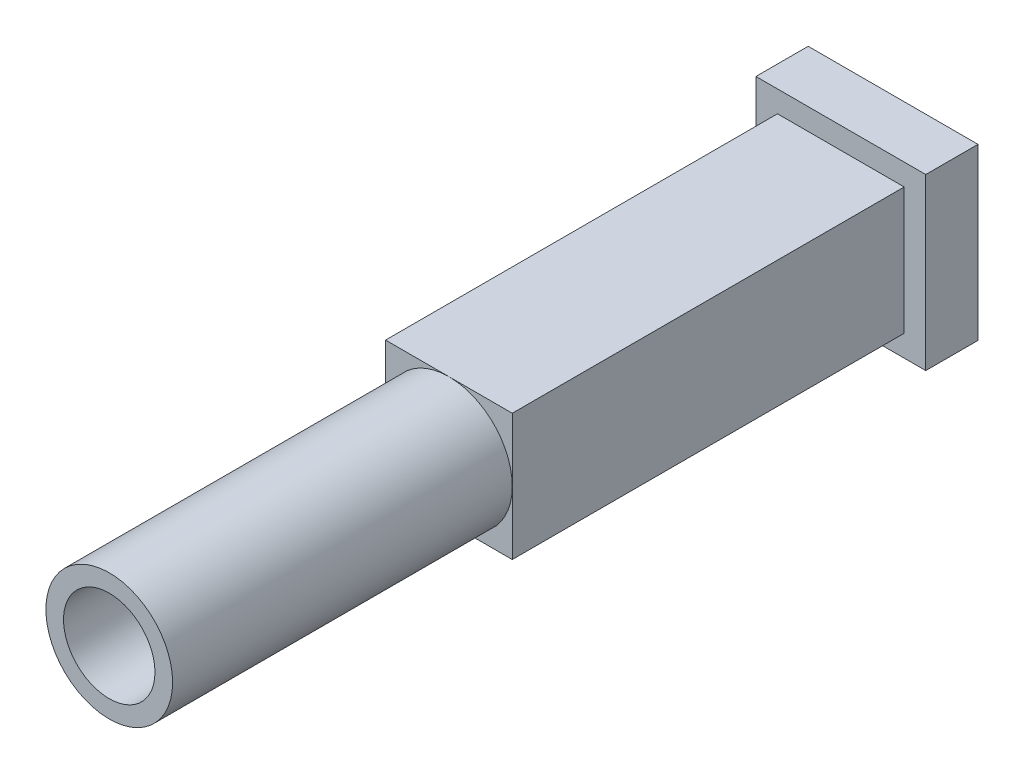
ISO-10303-21;
HEADER;
FILE_DESCRIPTION(('STEP AP214'),'2;1');
FILE_NAME('part.step','',(''),(''),'','','');
FILE_SCHEMA(('AUTOMOTIVE_DESIGN { 1 0 10303 214 1 1 1 1 }'));
ENDSEC;
DATA;
#1=APPLICATION_CONTEXT('core data for automotive mechanical design processes');
#2=APPLICATION_PROTOCOL_DEFINITION('international standard','automotive_design',2000,#1);
#3=PRODUCT_CONTEXT('',#1,'mechanical');
#4=PRODUCT('Part','Part','',(#3));
#5=PRODUCT_RELATED_PRODUCT_CATEGORY('part','',(#4));
#6=PRODUCT_DEFINITION_FORMATION('','',#4);
#7=PRODUCT_DEFINITION_CONTEXT('part definition',#1,'design');
#8=PRODUCT_DEFINITION('design','',#6,#7);
#9=PRODUCT_DEFINITION_SHAPE('','',#8);
#10=(LENGTH_UNIT() NAMED_UNIT(*) SI_UNIT(.MILLI.,.METRE.));
#11=(NAMED_UNIT(*) PLANE_ANGLE_UNIT() SI_UNIT($,.RADIAN.));
#12=(NAMED_UNIT(*) SI_UNIT($,.STERADIAN.) SOLID_ANGLE_UNIT());
#13=UNCERTAINTY_MEASURE_WITH_UNIT(LENGTH_MEASURE(1.E-05),#10,'distance_accuracy_value','');
#14=(GEOMETRIC_REPRESENTATION_CONTEXT(3) GLOBAL_UNCERTAINTY_ASSIGNED_CONTEXT((#13)) GLOBAL_UNIT_ASSIGNED_CONTEXT((#10,
#11,#12)) REPRESENTATION_CONTEXT('',''));
#15=CARTESIAN_POINT('',(0.,0.,0.));
#16=DIRECTION('',(0.,0.,1.));
#17=DIRECTION('',(1.,0.,0.));
#18=AXIS2_PLACEMENT_3D('',#15,#16,#17);
#19=CARTESIAN_POINT('',(0.,0.,30.));
#20=DIRECTION('',(0.,0.,1.));
#21=DIRECTION('',(1.,0.,0.));
#22=AXIS2_PLACEMENT_3D('',#19,#20,#21);
#23=PLANE('',#22);
#24=CARTESIAN_POINT('',(4.85,-4.85,30.));
#25=DIRECTION('',(0.,0.,1.));
#26=DIRECTION('',(1.,0.,0.));
#27=AXIS2_PLACEMENT_3D('',#24,#25,#26);
#28=CIRCLE('',#27,4.85);
#29=CARTESIAN_POINT('',(9.7,-4.85,30.));
#30=VERTEX_POINT('',#29);
#31=CARTESIAN_POINT('',(4.85,0.,30.));
#32=VERTEX_POINT('',#31);
#33=EDGE_CURVE('E57',#30,#32,#28,.T.);
#34=ORIENTED_EDGE('',*,*,#33,.F.);
#35=DIRECTION('',(0.,1.,0.));
#36=VECTOR('',#35,1.);
#37=CARTESIAN_POINT('',(9.7,0.,30.));
#38=LINE('',#37,#36);
#39=CARTESIAN_POINT('',(9.7,0.,30.));
#40=VERTEX_POINT('',#39);
#41=EDGE_CURVE('E175',#30,#40,#38,.T.);
#42=ORIENTED_EDGE('',*,*,#41,.T.);
#43=DIRECTION('',(-1.,0.,0.));
#44=VECTOR('',#43,1.);
#45=CARTESIAN_POINT('',(0.,0.,30.));
#46=LINE('',#45,#44);
#47=EDGE_CURVE('E180',#40,#32,#46,.T.);
#48=ORIENTED_EDGE('',*,*,#47,.T.);
#49=EDGE_LOOP('',(#34,#42,#48));
#50=FACE_BOUND('',#49,.T.);
#51=ADVANCED_FACE('F45',(#50),#23,.T.);
#52=CARTESIAN_POINT('',(0.,-4.85,30.));
#53=VERTEX_POINT('',#52);
#54=EDGE_CURVE('E11',#32,#53,#28,.T.);
#55=ORIENTED_EDGE('',*,*,#54,.F.);
#56=CARTESIAN_POINT('',(0.,0.,30.));
#57=VERTEX_POINT('',#56);
#58=EDGE_CURVE('E179',#32,#57,#46,.T.);
#59=ORIENTED_EDGE('',*,*,#58,.T.);
#60=DIRECTION('',(0.,-1.,0.));
#61=VECTOR('',#60,1.);
#62=CARTESIAN_POINT('',(0.,0.,30.));
#63=LINE('',#62,#61);
#64=EDGE_CURVE('E166',#57,#53,#63,.T.);
#65=ORIENTED_EDGE('',*,*,#64,.T.);
#66=EDGE_LOOP('',(#55,#59,#65));
#67=FACE_BOUND('',#66,.T.);
#68=ADVANCED_FACE('F228',(#67),#23,.T.);
#69=CARTESIAN_POINT('',(4.85,-9.7,30.));
#70=VERTEX_POINT('',#69);
#71=EDGE_CURVE('E55',#53,#70,#28,.T.);
#72=ORIENTED_EDGE('',*,*,#71,.F.);
#73=CARTESIAN_POINT('',(0.,-9.7,30.));
#74=VERTEX_POINT('',#73);
#75=EDGE_CURVE('E170',#53,#74,#63,.T.);
#76=ORIENTED_EDGE('',*,*,#75,.T.);
#77=DIRECTION('',(1.,0.,0.));
#78=VECTOR('',#77,1.);
#79=CARTESIAN_POINT('',(0.,-9.7,30.));
#80=LINE('',#79,#78);
#81=EDGE_CURVE('E171',#74,#70,#80,.T.);
#82=ORIENTED_EDGE('',*,*,#81,.T.);
#83=EDGE_LOOP('',(#72,#76,#82));
#84=FACE_BOUND('',#83,.T.);
#85=ADVANCED_FACE('F224',(#84),#23,.T.);
#86=CARTESIAN_POINT('',(0.,0.,30.));
#87=DIRECTION('',(1.,0.,0.));
#88=DIRECTION('',(0.,1.,0.));
#89=AXIS2_PLACEMENT_3D('',#86,#87,#88);
#90=PLANE('',#89);
#91=DIRECTION('',(0.,-1.,0.));
#92=VECTOR('',#91,1.);
#93=CARTESIAN_POINT('',(0.,0.,0.));
#94=LINE('',#93,#92);
#95=CARTESIAN_POINT('',(0.,0.,0.));
#96=VERTEX_POINT('',#95);
#97=CARTESIAN_POINT('',(0.,-9.7,0.));
#98=VERTEX_POINT('',#97);
#99=EDGE_CURVE('E164',#96,#98,#94,.T.);
#100=ORIENTED_EDGE('',*,*,#99,.T.);
#101=DIRECTION('',(0.,0.,-1.));
#102=VECTOR('',#101,1.);
#103=CARTESIAN_POINT('',(0.,-9.7,30.));
#104=LINE('',#103,#102);
#105=EDGE_CURVE('E49',#74,#98,#104,.T.);
#106=ORIENTED_EDGE('',*,*,#105,.F.);
#107=ORIENTED_EDGE('',*,*,#75,.F.);
#108=ORIENTED_EDGE('',*,*,#64,.F.);
#109=DIRECTION('',(0.,0.,-1.));
#110=VECTOR('',#109,1.);
#111=CARTESIAN_POINT('',(0.,0.,30.));
#112=LINE('',#111,#110);
#113=EDGE_CURVE('E184',#57,#96,#112,.T.);
#114=ORIENTED_EDGE('',*,*,#113,.T.);
#115=EDGE_LOOP('',(#100,#106,#107,#108,#114));
#116=FACE_BOUND('',#115,.T.);
#117=ADVANCED_FACE('F47',(#116),#90,.F.);
#118=CARTESIAN_POINT('',(0.,-9.7,30.));
#119=DIRECTION('',(0.,1.,0.));
#120=DIRECTION('',(0.,0.,1.));
#121=AXIS2_PLACEMENT_3D('',#118,#119,#120);
#122=PLANE('',#121);
#123=DIRECTION('',(1.,0.,0.));
#124=VECTOR('',#123,1.);
#125=CARTESIAN_POINT('',(0.,-9.7,0.));
#126=LINE('',#125,#124);
#127=CARTESIAN_POINT('',(9.7,-9.7,0.));
#128=VERTEX_POINT('',#127);
#129=EDGE_CURVE('E188',#98,#128,#126,.T.);
#130=ORIENTED_EDGE('',*,*,#129,.T.);
#131=DIRECTION('',(0.,0.,-1.));
#132=VECTOR('',#131,1.);
#133=CARTESIAN_POINT('',(9.7,-9.7,30.));
#134=LINE('',#133,#132);
#135=CARTESIAN_POINT('',(9.7,-9.7,30.));
#136=VERTEX_POINT('',#135);
#137=EDGE_CURVE('E206',#136,#128,#134,.T.);
#138=ORIENTED_EDGE('',*,*,#137,.F.);
#139=EDGE_CURVE('E169',#70,#136,#80,.T.);
#140=ORIENTED_EDGE('',*,*,#139,.F.);
#141=ORIENTED_EDGE('',*,*,#81,.F.);
#142=ORIENTED_EDGE('',*,*,#105,.T.);
#143=EDGE_LOOP('',(#130,#138,#140,#141,#142));
#144=FACE_BOUND('',#143,.T.);
#145=ADVANCED_FACE('F237',(#144),#122,.F.);
#146=CARTESIAN_POINT('',(9.7,0.,30.));
#147=DIRECTION('',(-1.,0.,0.));
#148=DIRECTION('',(0.,-1.,0.));
#149=AXIS2_PLACEMENT_3D('',#146,#147,#148);
#150=PLANE('',#149);
#151=DIRECTION('',(0.,1.,0.));
#152=VECTOR('',#151,1.);
#153=CARTESIAN_POINT('',(9.7,0.,0.));
#154=LINE('',#153,#152);
#155=CARTESIAN_POINT('',(9.7,0.,0.));
#156=VERTEX_POINT('',#155);
#157=EDGE_CURVE('E192',#128,#156,#154,.T.);
#158=ORIENTED_EDGE('',*,*,#157,.T.);
#159=DIRECTION('',(0.,0.,-1.));
#160=VECTOR('',#159,1.);
#161=CARTESIAN_POINT('',(9.7,0.,30.));
#162=LINE('',#161,#160);
#163=EDGE_CURVE('E203',#40,#156,#162,.T.);
#164=ORIENTED_EDGE('',*,*,#163,.F.);
#165=ORIENTED_EDGE('',*,*,#41,.F.);
#166=EDGE_CURVE('E176',#136,#30,#38,.T.);
#167=ORIENTED_EDGE('',*,*,#166,.F.);
#168=ORIENTED_EDGE('',*,*,#137,.T.);
#169=EDGE_LOOP('',(#158,#164,#165,#167,#168));
#170=FACE_BOUND('',#169,.T.);
#171=ADVANCED_FACE('F239',(#170),#150,.F.);
#172=CARTESIAN_POINT('',(0.,0.,30.));
#173=DIRECTION('',(0.,-1.,0.));
#174=DIRECTION('',(0.,0.,-1.));
#175=AXIS2_PLACEMENT_3D('',#172,#173,#174);
#176=PLANE('',#175);
#177=DIRECTION('',(-1.,0.,0.));
#178=VECTOR('',#177,1.);
#179=CARTESIAN_POINT('',(0.,0.,0.));
#180=LINE('',#179,#178);
#181=EDGE_CURVE('E196',#156,#96,#180,.T.);
#182=ORIENTED_EDGE('',*,*,#181,.T.);
#183=ORIENTED_EDGE('',*,*,#113,.F.);
#184=ORIENTED_EDGE('',*,*,#58,.F.);
#185=ORIENTED_EDGE('',*,*,#47,.F.);
#186=ORIENTED_EDGE('',*,*,#163,.T.);
#187=EDGE_LOOP('',(#182,#183,#184,#185,#186));
#188=FACE_BOUND('',#187,.T.);
#189=ADVANCED_FACE('F233',(#188),#176,.F.);
#190=EDGE_CURVE('E70',#70,#30,#28,.T.);
#191=ORIENTED_EDGE('',*,*,#190,.F.);
#192=ORIENTED_EDGE('',*,*,#139,.T.);
#193=ORIENTED_EDGE('',*,*,#166,.T.);
#194=EDGE_LOOP('',(#191,#192,#193));
#195=FACE_BOUND('',#194,.T.);
#196=ADVANCED_FACE('F242',(#195),#23,.T.);
#197=CARTESIAN_POINT('',(4.85,-4.85,56.));
#198=DIRECTION('',(0.,0.,-1.));
#199=DIRECTION('',(-1.,0.,0.));
#200=AXIS2_PLACEMENT_3D('',#197,#198,#199);
#201=CYLINDRICAL_SURFACE('',#200,4.85);
#202=CARTESIAN_POINT('',(4.85,-4.85,56.));
#203=DIRECTION('',(0.,0.,1.));
#204=DIRECTION('',(1.,0.,0.));
#205=AXIS2_PLACEMENT_3D('',#202,#203,#204);
#206=CIRCLE('',#205,4.85);
#207=CARTESIAN_POINT('',(9.7,-4.85,56.));
#208=VERTEX_POINT('',#207);
#209=EDGE_CURVE('E157',#208,#208,#206,.T.);
#210=ORIENTED_EDGE('',*,*,#209,.F.);
#211=EDGE_LOOP('',(#210));
#212=FACE_BOUND('',#211,.T.);
#213=ORIENTED_EDGE('',*,*,#33,.T.);
#214=ORIENTED_EDGE('',*,*,#54,.T.);
#215=ORIENTED_EDGE('',*,*,#71,.T.);
#216=ORIENTED_EDGE('',*,*,#190,.T.);
#217=EDGE_LOOP('',(#213,#214,#215,#216));
#218=FACE_BOUND('',#217,.T.);
#219=ADVANCED_FACE('F221',(#212,#218),#201,.T.);
#220=CARTESIAN_POINT('',(4.85,-4.85,56.));
#221=DIRECTION('',(0.,0.,1.));
#222=DIRECTION('',(1.,0.,0.));
#223=AXIS2_PLACEMENT_3D('',#220,#221,#222);
#224=PLANE('',#223);
#225=CARTESIAN_POINT('',(4.85,-4.84999999999999,56.));
#226=DIRECTION('',(0.,0.,1.));
#227=DIRECTION('',(1.,0.,0.));
#228=AXIS2_PLACEMENT_3D('',#225,#226,#227);
#229=CIRCLE('',#228,3.5);
#230=CARTESIAN_POINT('',(8.35,-4.84999999999999,56.));
#231=VERTEX_POINT('',#230);
#232=EDGE_CURVE('E400',#231,#231,#229,.T.);
#233=ORIENTED_EDGE('',*,*,#232,.F.);
#234=EDGE_LOOP('',(#233));
#235=FACE_BOUND('',#234,.T.);
#236=ORIENTED_EDGE('',*,*,#209,.T.);
#237=EDGE_LOOP('',(#236));
#238=FACE_BOUND('',#237,.T.);
#239=ADVANCED_FACE('F258',(#235,#238),#224,.T.);
#240=CARTESIAN_POINT('',(11.35,1.65,-4.));
#241=DIRECTION('',(-1.,0.,0.));
#242=DIRECTION('',(0.,0.,1.));
#243=AXIS2_PLACEMENT_3D('',#240,#241,#242);
#244=PLANE('',#243);
#245=DIRECTION('',(0.,-1.,0.));
#246=VECTOR('',#245,1.);
#247=CARTESIAN_POINT('',(11.35,1.65,0.));
#248=LINE('',#247,#246);
#249=CARTESIAN_POINT('',(11.35,1.65,0.));
#250=VERTEX_POINT('',#249);
#251=CARTESIAN_POINT('',(11.35,-11.35,0.));
#252=VERTEX_POINT('',#251);
#253=EDGE_CURVE('E151',#250,#252,#248,.T.);
#254=ORIENTED_EDGE('',*,*,#253,.T.);
#255=DIRECTION('',(0.,0.,1.));
#256=VECTOR('',#255,1.);
#257=CARTESIAN_POINT('',(11.35,-11.35,-4.));
#258=LINE('',#257,#256);
#259=CARTESIAN_POINT('',(11.35,-11.35,-4.));
#260=VERTEX_POINT('',#259);
#261=EDGE_CURVE('E130',#260,#252,#258,.T.);
#262=ORIENTED_EDGE('',*,*,#261,.F.);
#263=DIRECTION('',(0.,-1.,0.));
#264=VECTOR('',#263,1.);
#265=CARTESIAN_POINT('',(11.35,1.65,-4.));
#266=LINE('',#265,#264);
#267=CARTESIAN_POINT('',(11.35,1.65,-4.));
#268=VERTEX_POINT('',#267);
#269=EDGE_CURVE('E138',#268,#260,#266,.T.);
#270=ORIENTED_EDGE('',*,*,#269,.F.);
#271=DIRECTION('',(0.,0.,1.));
#272=VECTOR('',#271,1.);
#273=CARTESIAN_POINT('',(11.35,1.65,-4.));
#274=LINE('',#273,#272);
#275=EDGE_CURVE('E412',#268,#250,#274,.T.);
#276=ORIENTED_EDGE('',*,*,#275,.T.);
#277=EDGE_LOOP('',(#254,#262,#270,#276));
#278=FACE_BOUND('',#277,.T.);
#279=ADVANCED_FACE('F149',(#278),#244,.F.);
#280=CARTESIAN_POINT('',(11.35,-11.35,-4.));
#281=DIRECTION('',(0.,1.,0.));
#282=DIRECTION('',(0.,0.,1.));
#283=AXIS2_PLACEMENT_3D('',#280,#281,#282);
#284=PLANE('',#283);
#285=DIRECTION('',(-1.,0.,0.));
#286=VECTOR('',#285,1.);
#287=CARTESIAN_POINT('',(11.35,-11.35,0.));
#288=LINE('',#287,#286);
#289=CARTESIAN_POINT('',(-1.65,-11.35,0.));
#290=VERTEX_POINT('',#289);
#291=EDGE_CURVE('E404',#252,#290,#288,.T.);
#292=ORIENTED_EDGE('',*,*,#291,.T.);
#293=DIRECTION('',(0.,0.,1.));
#294=VECTOR('',#293,1.);
#295=CARTESIAN_POINT('',(-1.65,-11.35,-4.));
#296=LINE('',#295,#294);
#297=CARTESIAN_POINT('',(-1.65,-11.35,-4.));
#298=VERTEX_POINT('',#297);
#299=EDGE_CURVE('E132',#298,#290,#296,.T.);
#300=ORIENTED_EDGE('',*,*,#299,.F.);
#301=DIRECTION('',(-1.,0.,0.));
#302=VECTOR('',#301,1.);
#303=CARTESIAN_POINT('',(11.35,-11.35,-4.));
#304=LINE('',#303,#302);
#305=EDGE_CURVE('E125',#260,#298,#304,.T.);
#306=ORIENTED_EDGE('',*,*,#305,.F.);
#307=ORIENTED_EDGE('',*,*,#261,.T.);
#308=EDGE_LOOP('',(#292,#300,#306,#307));
#309=FACE_BOUND('',#308,.T.);
#310=ADVANCED_FACE('F128',(#309),#284,.F.);
#311=CARTESIAN_POINT('',(-1.65,1.65,-4.));
#312=DIRECTION('',(-1.,0.,0.));
#313=DIRECTION('',(0.,0.,1.));
#314=AXIS2_PLACEMENT_3D('',#311,#312,#313);
#315=PLANE('',#314);
#316=DIRECTION('',(0.,-1.,0.));
#317=VECTOR('',#316,1.);
#318=CARTESIAN_POINT('',(-1.65,1.65,0.));
#319=LINE('',#318,#317);
#320=CARTESIAN_POINT('',(-1.65,1.65,0.));
#321=VERTEX_POINT('',#320);
#322=EDGE_CURVE('E416',#321,#290,#319,.T.);
#323=ORIENTED_EDGE('',*,*,#322,.F.);
#324=DIRECTION('',(0.,0.,1.));
#325=VECTOR('',#324,1.);
#326=CARTESIAN_POINT('',(-1.65,1.65,-4.));
#327=LINE('',#326,#325);
#328=CARTESIAN_POINT('',(-1.65,1.65,-4.));
#329=VERTEX_POINT('',#328);
#330=EDGE_CURVE('E158',#329,#321,#327,.T.);
#331=ORIENTED_EDGE('',*,*,#330,.F.);
#332=DIRECTION('',(0.,-1.,0.));
#333=VECTOR('',#332,1.);
#334=CARTESIAN_POINT('',(-1.65,1.65,-4.));
#335=LINE('',#334,#333);
#336=EDGE_CURVE('E137',#329,#298,#335,.T.);
#337=ORIENTED_EDGE('',*,*,#336,.T.);
#338=ORIENTED_EDGE('',*,*,#299,.T.);
#339=EDGE_LOOP('',(#323,#331,#337,#338));
#340=FACE_BOUND('',#339,.T.);
#341=ADVANCED_FACE('F293',(#340),#315,.T.);
#342=CARTESIAN_POINT('',(11.35,1.65,-4.));
#343=DIRECTION('',(0.,1.,0.));
#344=DIRECTION('',(0.,0.,1.));
#345=AXIS2_PLACEMENT_3D('',#342,#343,#344);
#346=PLANE('',#345);
#347=DIRECTION('',(-1.,0.,0.));
#348=VECTOR('',#347,1.);
#349=CARTESIAN_POINT('',(11.35,1.65,0.));
#350=LINE('',#349,#348);
#351=EDGE_CURVE('E147',#250,#321,#350,.T.);
#352=ORIENTED_EDGE('',*,*,#351,.F.);
#353=ORIENTED_EDGE('',*,*,#275,.F.);
#354=DIRECTION('',(-1.,0.,0.));
#355=VECTOR('',#354,1.);
#356=CARTESIAN_POINT('',(11.35,1.65,-4.));
#357=LINE('',#356,#355);
#358=EDGE_CURVE('E144',#268,#329,#357,.T.);
#359=ORIENTED_EDGE('',*,*,#358,.T.);
#360=ORIENTED_EDGE('',*,*,#330,.T.);
#361=EDGE_LOOP('',(#352,#353,#359,#360));
#362=FACE_BOUND('',#361,.T.);
#363=ADVANCED_FACE('F301',(#362),#346,.T.);
#364=CARTESIAN_POINT('',(0.,0.,-4.));
#365=DIRECTION('',(0.,0.,-1.));
#366=DIRECTION('',(-1.,0.,0.));
#367=AXIS2_PLACEMENT_3D('',#364,#365,#366);
#368=PLANE('',#367);
#369=ORIENTED_EDGE('',*,*,#269,.T.);
#370=ORIENTED_EDGE('',*,*,#305,.T.);
#371=ORIENTED_EDGE('',*,*,#336,.F.);
#372=ORIENTED_EDGE('',*,*,#358,.F.);
#373=EDGE_LOOP('',(#369,#370,#371,#372));
#374=FACE_BOUND('',#373,.T.);
#375=ADVANCED_FACE('F142',(#374),#368,.T.);
#376=CARTESIAN_POINT('',(0.,0.,0.));
#377=DIRECTION('',(0.,0.,-1.));
#378=DIRECTION('',(-1.,0.,0.));
#379=AXIS2_PLACEMENT_3D('',#376,#377,#378);
#380=PLANE('',#379);
#381=ORIENTED_EDGE('',*,*,#99,.F.);
#382=ORIENTED_EDGE('',*,*,#181,.F.);
#383=ORIENTED_EDGE('',*,*,#157,.F.);
#384=ORIENTED_EDGE('',*,*,#129,.F.);
#385=EDGE_LOOP('',(#381,#382,#383,#384));
#386=FACE_BOUND('',#385,.T.);
#387=ORIENTED_EDGE('',*,*,#253,.F.);
#388=ORIENTED_EDGE('',*,*,#351,.T.);
#389=ORIENTED_EDGE('',*,*,#322,.T.);
#390=ORIENTED_EDGE('',*,*,#291,.F.);
#391=EDGE_LOOP('',(#387,#388,#389,#390));
#392=FACE_BOUND('',#391,.T.);
#393=ADVANCED_FACE('F235',(#386,#392),#380,.F.);
#394=CARTESIAN_POINT('',(4.85,-4.84999999999999,46.));
#395=DIRECTION('',(0.,0.,1.));
#396=DIRECTION('',(1.,0.,0.));
#397=AXIS2_PLACEMENT_3D('',#394,#395,#396);
#398=CYLINDRICAL_SURFACE('',#397,3.5);
#399=CARTESIAN_POINT('',(4.85,-4.84999999999999,46.));
#400=DIRECTION('',(0.,0.,1.));
#401=DIRECTION('',(1.,0.,0.));
#402=AXIS2_PLACEMENT_3D('',#399,#400,#401);
#403=CIRCLE('',#402,3.5);
#404=CARTESIAN_POINT('',(8.35,-4.84999999999999,46.));
#405=VERTEX_POINT('',#404);
#406=EDGE_CURVE('E398',#405,#405,#403,.T.);
#407=ORIENTED_EDGE('',*,*,#406,.F.);
#408=EDGE_LOOP('',(#407));
#409=FACE_BOUND('',#408,.T.);
#410=ORIENTED_EDGE('',*,*,#232,.T.);
#411=EDGE_LOOP('',(#410));
#412=FACE_BOUND('',#411,.T.);
#413=ADVANCED_FACE('F325',(#409,#412),#398,.F.);
#414=CARTESIAN_POINT('',(4.85,-4.84999999999999,46.));
#415=DIRECTION('',(0.,0.,1.));
#416=DIRECTION('',(1.,0.,0.));
#417=AXIS2_PLACEMENT_3D('',#414,#415,#416);
#418=PLANE('',#417);
#419=ORIENTED_EDGE('',*,*,#406,.T.);
#420=EDGE_LOOP('',(#419));
#421=FACE_BOUND('',#420,.T.);
#422=ADVANCED_FACE('F341',(#421),#418,.T.);
#423=CLOSED_SHELL('',(#51,#68,#85,#117,#145,#171,#189,#196,#219,#239,#279,#310,#341,#363,#375,
#393,#413,#422));
#424=MANIFOLD_SOLID_BREP('B2',#423);
#425=ADVANCED_BREP_SHAPE_REPRESENTATION('',(#18,#424),#14);
#426=SHAPE_DEFINITION_REPRESENTATION(#9,#425);
ENDSEC;
END-ISO-10303-21;
